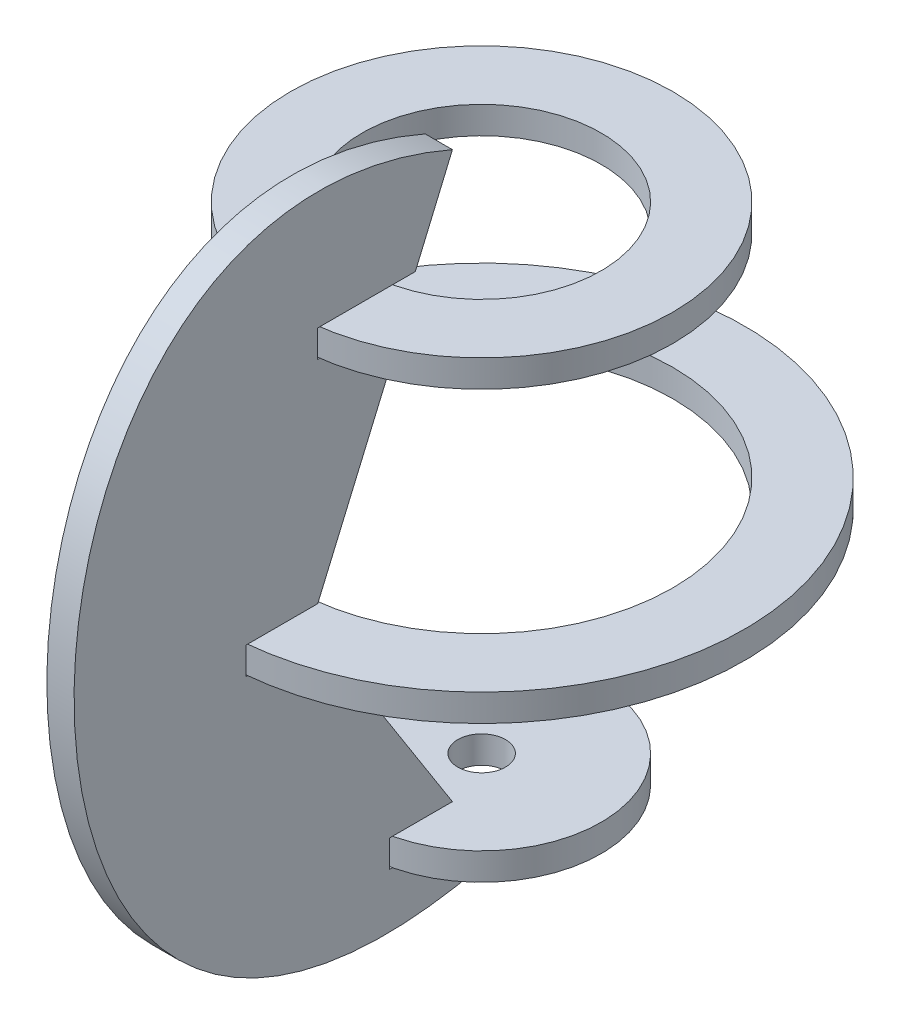
ISO-10303-21;
HEADER;
FILE_DESCRIPTION(('STEP AP214'),'2;1');
FILE_NAME('part.step','',(''),(''),'','','');
FILE_SCHEMA(('AUTOMOTIVE_DESIGN { 1 0 10303 214 1 1 1 1 }'));
ENDSEC;
DATA;
#1=APPLICATION_CONTEXT('core data for automotive mechanical design processes');
#2=APPLICATION_PROTOCOL_DEFINITION('international standard','automotive_design',2000,#1);
#3=PRODUCT_CONTEXT('',#1,'mechanical');
#4=PRODUCT('Part','Part','',(#3));
#5=PRODUCT_RELATED_PRODUCT_CATEGORY('part','',(#4));
#6=PRODUCT_DEFINITION_FORMATION('','',#4);
#7=PRODUCT_DEFINITION_CONTEXT('part definition',#1,'design');
#8=PRODUCT_DEFINITION('design','',#6,#7);
#9=PRODUCT_DEFINITION_SHAPE('','',#8);
#10=(LENGTH_UNIT() NAMED_UNIT(*) SI_UNIT(.MILLI.,.METRE.));
#11=(NAMED_UNIT(*) PLANE_ANGLE_UNIT() SI_UNIT($,.RADIAN.));
#12=(NAMED_UNIT(*) SI_UNIT($,.STERADIAN.) SOLID_ANGLE_UNIT());
#13=UNCERTAINTY_MEASURE_WITH_UNIT(LENGTH_MEASURE(1.E-05),#10,'distance_accuracy_value','');
#14=(GEOMETRIC_REPRESENTATION_CONTEXT(3) GLOBAL_UNCERTAINTY_ASSIGNED_CONTEXT((#13)) GLOBAL_UNIT_ASSIGNED_CONTEXT((#10,
#11,#12)) REPRESENTATION_CONTEXT('',''));
#15=CARTESIAN_POINT('',(0.,0.,0.));
#16=DIRECTION('',(0.,0.,1.));
#17=DIRECTION('',(1.,0.,0.));
#18=AXIS2_PLACEMENT_3D('',#15,#16,#17);
#19=CARTESIAN_POINT('',(5.7,0.,5.));
#20=DIRECTION('',(0.,0.,-1.));
#21=DIRECTION('',(-1.,0.,0.));
#22=AXIS2_PLACEMENT_3D('',#19,#20,#21);
#23=PLANE('',#22);
#24=DIRECTION('',(0.,-1.,0.));
#25=VECTOR('',#24,1.);
#26=CARTESIAN_POINT('',(0.,0.,5.));
#27=LINE('',#26,#25);
#28=CARTESIAN_POINT('',(0.,0.,5.));
#29=VERTEX_POINT('',#28);
#30=CARTESIAN_POINT('',(0.,-8.77412214334572,5.));
#31=VERTEX_POINT('',#30);
#32=EDGE_CURVE('E303',#29,#31,#27,.T.);
#33=ORIENTED_EDGE('',*,*,#32,.F.);
#34=DIRECTION('',(-1.,0.,0.));
#35=VECTOR('',#34,1.);
#36=CARTESIAN_POINT('',(5.7,0.,5.));
#37=LINE('',#36,#35);
#38=CARTESIAN_POINT('',(5.7,0.,5.));
#39=VERTEX_POINT('',#38);
#40=EDGE_CURVE('E13',#39,#29,#37,.T.);
#41=ORIENTED_EDGE('',*,*,#40,.F.);
#42=DIRECTION('',(0.,-1.,0.));
#43=VECTOR('',#42,1.);
#44=CARTESIAN_POINT('',(5.7,0.,5.));
#45=LINE('',#44,#43);
#46=CARTESIAN_POINT('',(5.7,-8.77412214334572,5.));
#47=VERTEX_POINT('',#46);
#48=EDGE_CURVE('E240',#39,#47,#45,.T.);
#49=ORIENTED_EDGE('',*,*,#48,.T.);
#50=DIRECTION('',(-1.,0.,0.));
#51=VECTOR('',#50,1.);
#52=CARTESIAN_POINT('',(5.7,-8.77412214334572,5.));
#53=LINE('',#52,#51);
#54=EDGE_CURVE('E52',#47,#31,#53,.T.);
#55=ORIENTED_EDGE('',*,*,#54,.T.);
#56=EDGE_LOOP('',(#33,#41,#49,#55));
#57=FACE_BOUND('',#56,.T.);
#58=ADVANCED_FACE('F49',(#57),#23,.T.);
#59=CARTESIAN_POINT('',(5.7,0.,25.0225));
#60=DIRECTION('',(0.,1.,0.));
#61=DIRECTION('',(0.,0.,1.));
#62=AXIS2_PLACEMENT_3D('',#59,#60,#61);
#63=PLANE('',#62);
#64=DIRECTION('',(0.,0.,-1.));
#65=VECTOR('',#64,1.);
#66=CARTESIAN_POINT('',(0.,0.,25.0225));
#67=LINE('',#66,#65);
#68=CARTESIAN_POINT('',(0.,0.,25.0225));
#69=VERTEX_POINT('',#68);
#70=EDGE_CURVE('E308',#69,#29,#67,.T.);
#71=ORIENTED_EDGE('',*,*,#70,.F.);
#72=DIRECTION('',(-1.,0.,0.));
#73=VECTOR('',#72,1.);
#74=CARTESIAN_POINT('',(5.7,0.,25.0225));
#75=LINE('',#74,#73);
#76=CARTESIAN_POINT('',(5.7,0.,25.0225));
#77=VERTEX_POINT('',#76);
#78=EDGE_CURVE('E58',#77,#69,#75,.T.);
#79=ORIENTED_EDGE('',*,*,#78,.F.);
#80=DIRECTION('',(0.,0.,-1.));
#81=VECTOR('',#80,1.);
#82=CARTESIAN_POINT('',(5.7,0.,25.0225));
#83=LINE('',#82,#81);
#84=EDGE_CURVE('E172',#77,#39,#83,.T.);
#85=ORIENTED_EDGE('',*,*,#84,.T.);
#86=ORIENTED_EDGE('',*,*,#40,.T.);
#87=EDGE_LOOP('',(#71,#79,#85,#86));
#88=FACE_BOUND('',#87,.T.);
#89=ADVANCED_FACE('F289',(#88),#63,.T.);
#90=CARTESIAN_POINT('',(5.7,5.7,25.0225));
#91=DIRECTION('',(0.,0.,-1.));
#92=DIRECTION('',(-1.,0.,0.));
#93=AXIS2_PLACEMENT_3D('',#90,#91,#92);
#94=PLANE('',#93);
#95=DIRECTION('',(0.,-1.,0.));
#96=VECTOR('',#95,1.);
#97=CARTESIAN_POINT('',(0.,5.7,25.0225));
#98=LINE('',#97,#96);
#99=CARTESIAN_POINT('',(0.,5.7,25.0225));
#100=VERTEX_POINT('',#99);
#101=EDGE_CURVE('E159',#100,#69,#98,.T.);
#102=ORIENTED_EDGE('',*,*,#101,.F.);
#103=DIRECTION('',(-1.,0.,0.));
#104=VECTOR('',#103,1.);
#105=CARTESIAN_POINT('',(5.7,5.7,25.0225));
#106=LINE('',#105,#104);
#107=CARTESIAN_POINT('',(5.7,5.7,25.0225));
#108=VERTEX_POINT('',#107);
#109=EDGE_CURVE('E154',#108,#100,#106,.T.);
#110=ORIENTED_EDGE('',*,*,#109,.F.);
#111=DIRECTION('',(0.,-1.,0.));
#112=VECTOR('',#111,1.);
#113=CARTESIAN_POINT('',(5.7,5.7,25.0225));
#114=LINE('',#113,#112);
#115=EDGE_CURVE('E157',#108,#77,#114,.T.);
#116=ORIENTED_EDGE('',*,*,#115,.T.);
#117=ORIENTED_EDGE('',*,*,#78,.T.);
#118=EDGE_LOOP('',(#102,#110,#116,#117));
#119=FACE_BOUND('',#118,.T.);
#120=ADVANCED_FACE('F156',(#119),#94,.T.);
#121=CARTESIAN_POINT('',(5.7,5.7,11.8183247946143));
#122=DIRECTION('',(0.,-1.,0.));
#123=DIRECTION('',(0.,0.,-1.));
#124=AXIS2_PLACEMENT_3D('',#121,#122,#123);
#125=PLANE('',#124);
#126=DIRECTION('',(0.,0.,1.));
#127=VECTOR('',#126,1.);
#128=CARTESIAN_POINT('',(0.,5.7,11.8183247946143));
#129=LINE('',#128,#127);
#130=CARTESIAN_POINT('',(0.,5.7,11.8183247946143));
#131=VERTEX_POINT('',#130);
#132=EDGE_CURVE('E311',#131,#100,#129,.T.);
#133=ORIENTED_EDGE('',*,*,#132,.F.);
#134=DIRECTION('',(-1.,0.,0.));
#135=VECTOR('',#134,1.);
#136=CARTESIAN_POINT('',(5.7,5.7,11.8183247946143));
#137=LINE('',#136,#135);
#138=CARTESIAN_POINT('',(5.7,5.7,11.8183247946143));
#139=VERTEX_POINT('',#138);
#140=EDGE_CURVE('E164',#139,#131,#137,.T.);
#141=ORIENTED_EDGE('',*,*,#140,.F.);
#142=DIRECTION('',(0.,0.,1.));
#143=VECTOR('',#142,1.);
#144=CARTESIAN_POINT('',(5.7,5.7,11.8183247946143));
#145=LINE('',#144,#143);
#146=EDGE_CURVE('E170',#139,#108,#145,.T.);
#147=ORIENTED_EDGE('',*,*,#146,.T.);
#148=ORIENTED_EDGE('',*,*,#109,.T.);
#149=EDGE_LOOP('',(#133,#141,#147,#148));
#150=FACE_BOUND('',#149,.T.);
#151=ADVANCED_FACE('F175',(#150),#125,.T.);
#152=CARTESIAN_POINT('',(5.7,50.0085592291944,40.0225));
#153=DIRECTION('',(0.,0.536981450409833,-0.843594050426953));
#154=DIRECTION('',(0.,0.843594050426953,0.536981450409833));
#155=AXIS2_PLACEMENT_3D('',#152,#153,#154);
#156=PLANE('',#155);
#157=DIRECTION('',(0.,-0.843594050426953,-0.536981450409833));
#158=VECTOR('',#157,1.);
#159=CARTESIAN_POINT('',(0.,50.0085592291944,40.0225));
#160=LINE('',#159,#158);
#161=CARTESIAN_POINT('',(0.,50.0085592291944,40.0225));
#162=VERTEX_POINT('',#161);
#163=EDGE_CURVE('E368',#162,#131,#160,.T.);
#164=ORIENTED_EDGE('',*,*,#163,.F.);
#165=DIRECTION('',(-1.,0.,0.));
#166=VECTOR('',#165,1.);
#167=CARTESIAN_POINT('',(5.7,50.0085592291944,40.0225));
#168=LINE('',#167,#166);
#169=CARTESIAN_POINT('',(5.7,50.0085592291944,40.0225));
#170=VERTEX_POINT('',#169);
#171=EDGE_CURVE('E317',#170,#162,#168,.T.);
#172=ORIENTED_EDGE('',*,*,#171,.F.);
#173=DIRECTION('',(0.,-0.843594050426953,-0.536981450409833));
#174=VECTOR('',#173,1.);
#175=CARTESIAN_POINT('',(5.7,50.0085592291944,40.0225));
#176=LINE('',#175,#174);
#177=EDGE_CURVE('E177',#170,#139,#176,.T.);
#178=ORIENTED_EDGE('',*,*,#177,.T.);
#179=ORIENTED_EDGE('',*,*,#140,.T.);
#180=EDGE_LOOP('',(#164,#172,#178,#179));
#181=FACE_BOUND('',#180,.T.);
#182=ADVANCED_FACE('F280',(#181),#156,.T.);
#183=CARTESIAN_POINT('',(5.7,50.,55.0225));
#184=DIRECTION('',(0.,0.999999837199141,0.000570615186728014));
#185=DIRECTION('',(0.,-0.000570615186728014,0.999999837199141));
#186=AXIS2_PLACEMENT_3D('',#183,#184,#185);
#187=PLANE('',#186);
#188=DIRECTION('',(0.,0.000570615186728014,-0.999999837199141));
#189=VECTOR('',#188,1.);
#190=CARTESIAN_POINT('',(0.,50.,55.0225));
#191=LINE('',#190,#189);
#192=CARTESIAN_POINT('',(0.,50.,55.0225));
#193=VERTEX_POINT('',#192);
#194=EDGE_CURVE('E365',#193,#162,#191,.T.);
#195=ORIENTED_EDGE('',*,*,#194,.F.);
#196=DIRECTION('',(-1.,0.,0.));
#197=VECTOR('',#196,1.);
#198=CARTESIAN_POINT('',(5.7,50.,55.0225));
#199=LINE('',#198,#197);
#200=CARTESIAN_POINT('',(5.7,50.,55.0225));
#201=VERTEX_POINT('',#200);
#202=EDGE_CURVE('E319',#201,#193,#199,.T.);
#203=ORIENTED_EDGE('',*,*,#202,.F.);
#204=DIRECTION('',(0.,0.000570615186728014,-0.999999837199141));
#205=VECTOR('',#204,1.);
#206=CARTESIAN_POINT('',(5.7,50.,55.0225));
#207=LINE('',#206,#205);
#208=EDGE_CURVE('E180',#201,#170,#207,.T.);
#209=ORIENTED_EDGE('',*,*,#208,.T.);
#210=ORIENTED_EDGE('',*,*,#171,.T.);
#211=EDGE_LOOP('',(#195,#203,#209,#210));
#212=FACE_BOUND('',#211,.T.);
#213=ADVANCED_FACE('F276',(#212),#187,.T.);
#214=CARTESIAN_POINT('',(5.7,55.7,55.0225));
#215=DIRECTION('',(0.,0.,-1.));
#216=DIRECTION('',(-1.,0.,0.));
#217=AXIS2_PLACEMENT_3D('',#214,#215,#216);
#218=PLANE('',#217);
#219=DIRECTION('',(0.,-1.,0.));
#220=VECTOR('',#219,1.);
#221=CARTESIAN_POINT('',(0.,55.7,55.0225));
#222=LINE('',#221,#220);
#223=CARTESIAN_POINT('',(0.,55.7,55.0225));
#224=VERTEX_POINT('',#223);
#225=EDGE_CURVE('E362',#224,#193,#222,.T.);
#226=ORIENTED_EDGE('',*,*,#225,.F.);
#227=DIRECTION('',(-1.,0.,0.));
#228=VECTOR('',#227,1.);
#229=CARTESIAN_POINT('',(5.7,55.7,55.0225));
#230=LINE('',#229,#228);
#231=CARTESIAN_POINT('',(5.7,55.7,55.0225));
#232=VERTEX_POINT('',#231);
#233=EDGE_CURVE('E321',#232,#224,#230,.T.);
#234=ORIENTED_EDGE('',*,*,#233,.F.);
#235=DIRECTION('',(0.,-1.,0.));
#236=VECTOR('',#235,1.);
#237=CARTESIAN_POINT('',(5.7,55.7,55.0225));
#238=LINE('',#237,#236);
#239=EDGE_CURVE('E198',#232,#201,#238,.T.);
#240=ORIENTED_EDGE('',*,*,#239,.T.);
#241=ORIENTED_EDGE('',*,*,#202,.T.);
#242=EDGE_LOOP('',(#226,#234,#240,#241));
#243=FACE_BOUND('',#242,.T.);
#244=ADVANCED_FACE('F272',(#243),#218,.T.);
#245=CARTESIAN_POINT('',(5.7,55.7,40.0225));
#246=DIRECTION('',(0.,-1.,0.));
#247=DIRECTION('',(0.,0.,-1.));
#248=AXIS2_PLACEMENT_3D('',#245,#246,#247);
#249=PLANE('',#248);
#250=DIRECTION('',(0.,0.,1.));
#251=VECTOR('',#250,1.);
#252=CARTESIAN_POINT('',(0.,55.7,40.0225));
#253=LINE('',#252,#251);
#254=CARTESIAN_POINT('',(0.,55.7,40.0225));
#255=VERTEX_POINT('',#254);
#256=EDGE_CURVE('E359',#255,#224,#253,.T.);
#257=ORIENTED_EDGE('',*,*,#256,.F.);
#258=DIRECTION('',(-1.,0.,0.));
#259=VECTOR('',#258,1.);
#260=CARTESIAN_POINT('',(5.7,55.7,40.0225));
#261=LINE('',#260,#259);
#262=CARTESIAN_POINT('',(5.7,55.7,40.0225));
#263=VERTEX_POINT('',#262);
#264=EDGE_CURVE('E323',#263,#255,#261,.T.);
#265=ORIENTED_EDGE('',*,*,#264,.F.);
#266=DIRECTION('',(0.,0.,1.));
#267=VECTOR('',#266,1.);
#268=CARTESIAN_POINT('',(5.7,55.7,40.0225));
#269=LINE('',#268,#267);
#270=EDGE_CURVE('E203',#263,#232,#269,.T.);
#271=ORIENTED_EDGE('',*,*,#270,.T.);
#272=ORIENTED_EDGE('',*,*,#233,.T.);
#273=EDGE_LOOP('',(#257,#265,#271,#272));
#274=FACE_BOUND('',#273,.T.);
#275=ADVANCED_FACE('F268',(#274),#249,.T.);
#276=CARTESIAN_POINT('',(5.7,100.,20.9989229059397));
#277=DIRECTION('',(0.,-0.394582674275684,-0.91886044270142));
#278=DIRECTION('',(0.,0.91886044270142,-0.394582674275685));
#279=AXIS2_PLACEMENT_3D('',#276,#277,#278);
#280=PLANE('',#279);
#281=DIRECTION('',(0.,-0.91886044270142,0.394582674275684));
#282=VECTOR('',#281,1.);
#283=CARTESIAN_POINT('',(0.,100.,20.9989229059397));
#284=LINE('',#283,#282);
#285=CARTESIAN_POINT('',(0.,100.,20.9989229059397));
#286=VERTEX_POINT('',#285);
#287=EDGE_CURVE('E356',#286,#255,#284,.T.);
#288=ORIENTED_EDGE('',*,*,#287,.F.);
#289=DIRECTION('',(-1.,0.,0.));
#290=VECTOR('',#289,1.);
#291=CARTESIAN_POINT('',(5.7,100.,20.9989229059397));
#292=LINE('',#291,#290);
#293=CARTESIAN_POINT('',(5.7,100.,20.9989229059397));
#294=VERTEX_POINT('',#293);
#295=EDGE_CURVE('E325',#294,#286,#292,.T.);
#296=ORIENTED_EDGE('',*,*,#295,.F.);
#297=DIRECTION('',(0.,-0.91886044270142,0.394582674275684));
#298=VECTOR('',#297,1.);
#299=CARTESIAN_POINT('',(5.7,100.,20.9989229059397));
#300=LINE('',#299,#298);
#301=EDGE_CURVE('E208',#294,#263,#300,.T.);
#302=ORIENTED_EDGE('',*,*,#301,.T.);
#303=ORIENTED_EDGE('',*,*,#264,.T.);
#304=EDGE_LOOP('',(#288,#296,#302,#303));
#305=FACE_BOUND('',#304,.T.);
#306=ADVANCED_FACE('F264',(#305),#280,.T.);
#307=CARTESIAN_POINT('',(5.7,100.,40.0225));
#308=DIRECTION('',(0.,1.,0.));
#309=DIRECTION('',(0.,0.,1.));
#310=AXIS2_PLACEMENT_3D('',#307,#308,#309);
#311=PLANE('',#310);
#312=DIRECTION('',(0.,0.,-1.));
#313=VECTOR('',#312,1.);
#314=CARTESIAN_POINT('',(0.,100.,40.0225));
#315=LINE('',#314,#313);
#316=CARTESIAN_POINT('',(0.,100.,40.0225));
#317=VERTEX_POINT('',#316);
#318=EDGE_CURVE('E353',#317,#286,#315,.T.);
#319=ORIENTED_EDGE('',*,*,#318,.F.);
#320=DIRECTION('',(-1.,0.,0.));
#321=VECTOR('',#320,1.);
#322=CARTESIAN_POINT('',(5.7,100.,40.0225));
#323=LINE('',#322,#321);
#324=CARTESIAN_POINT('',(5.7,100.,40.0225));
#325=VERTEX_POINT('',#324);
#326=EDGE_CURVE('E327',#325,#317,#323,.T.);
#327=ORIENTED_EDGE('',*,*,#326,.F.);
#328=DIRECTION('',(0.,0.,-1.));
#329=VECTOR('',#328,1.);
#330=CARTESIAN_POINT('',(5.7,100.,40.0225));
#331=LINE('',#330,#329);
#332=EDGE_CURVE('E216',#325,#294,#331,.T.);
#333=ORIENTED_EDGE('',*,*,#332,.T.);
#334=ORIENTED_EDGE('',*,*,#295,.T.);
#335=EDGE_LOOP('',(#319,#327,#333,#334));
#336=FACE_BOUND('',#335,.T.);
#337=ADVANCED_FACE('F260',(#336),#311,.T.);
#338=CARTESIAN_POINT('',(5.7,105.7,40.0225));
#339=DIRECTION('',(0.,0.,-1.));
#340=DIRECTION('',(-1.,0.,0.));
#341=AXIS2_PLACEMENT_3D('',#338,#339,#340);
#342=PLANE('',#341);
#343=DIRECTION('',(0.,-1.,0.));
#344=VECTOR('',#343,1.);
#345=CARTESIAN_POINT('',(0.,105.7,40.0225));
#346=LINE('',#345,#344);
#347=CARTESIAN_POINT('',(0.,105.7,40.0225));
#348=VERTEX_POINT('',#347);
#349=EDGE_CURVE('E350',#348,#317,#346,.T.);
#350=ORIENTED_EDGE('',*,*,#349,.F.);
#351=DIRECTION('',(-1.,0.,0.));
#352=VECTOR('',#351,1.);
#353=CARTESIAN_POINT('',(5.7,105.7,40.0225));
#354=LINE('',#353,#352);
#355=CARTESIAN_POINT('',(5.7,105.7,40.0225));
#356=VERTEX_POINT('',#355);
#357=EDGE_CURVE('E329',#356,#348,#354,.T.);
#358=ORIENTED_EDGE('',*,*,#357,.F.);
#359=DIRECTION('',(0.,-1.,0.));
#360=VECTOR('',#359,1.);
#361=CARTESIAN_POINT('',(5.7,105.7,40.0225));
#362=LINE('',#361,#360);
#363=EDGE_CURVE('E220',#356,#325,#362,.T.);
#364=ORIENTED_EDGE('',*,*,#363,.T.);
#365=ORIENTED_EDGE('',*,*,#326,.T.);
#366=EDGE_LOOP('',(#350,#358,#364,#365));
#367=FACE_BOUND('',#366,.T.);
#368=ADVANCED_FACE('F256',(#367),#342,.T.);
#369=CARTESIAN_POINT('',(5.7,105.7,19.5846525167893));
#370=DIRECTION('',(0.,-1.,0.));
#371=DIRECTION('',(0.,0.,-1.));
#372=AXIS2_PLACEMENT_3D('',#369,#370,#371);
#373=PLANE('',#372);
#374=DIRECTION('',(0.,0.,1.));
#375=VECTOR('',#374,1.);
#376=CARTESIAN_POINT('',(0.,105.7,19.5846525167893));
#377=LINE('',#376,#375);
#378=CARTESIAN_POINT('',(0.,105.7,19.5846525167893));
#379=VERTEX_POINT('',#378);
#380=EDGE_CURVE('E347',#379,#348,#377,.T.);
#381=ORIENTED_EDGE('',*,*,#380,.F.);
#382=DIRECTION('',(-1.,0.,0.));
#383=VECTOR('',#382,1.);
#384=CARTESIAN_POINT('',(5.7,105.7,19.5846525167893));
#385=LINE('',#384,#383);
#386=CARTESIAN_POINT('',(5.7,105.7,19.5846525167893));
#387=VERTEX_POINT('',#386);
#388=EDGE_CURVE('E331',#387,#379,#385,.T.);
#389=ORIENTED_EDGE('',*,*,#388,.F.);
#390=DIRECTION('',(0.,0.,1.));
#391=VECTOR('',#390,1.);
#392=CARTESIAN_POINT('',(5.7,105.7,19.5846525167893));
#393=LINE('',#392,#391);
#394=EDGE_CURVE('E225',#387,#356,#393,.T.);
#395=ORIENTED_EDGE('',*,*,#394,.T.);
#396=ORIENTED_EDGE('',*,*,#357,.T.);
#397=EDGE_LOOP('',(#381,#389,#395,#396));
#398=FACE_BOUND('',#397,.T.);
#399=ADVANCED_FACE('F252',(#398),#373,.T.);
#400=CARTESIAN_POINT('',(5.7,123.928781979037,11.8183247946143));
#401=DIRECTION('',(0.,-0.391956765841584,-0.919983637740914));
#402=DIRECTION('',(0.,0.919983637740915,-0.391956765841584));
#403=AXIS2_PLACEMENT_3D('',#400,#401,#402);
#404=PLANE('',#403);
#405=DIRECTION('',(0.,-0.919983637740914,0.391956765841584));
#406=VECTOR('',#405,1.);
#407=CARTESIAN_POINT('',(0.,123.928781979037,11.8183247946143));
#408=LINE('',#407,#406);
#409=CARTESIAN_POINT('',(0.,123.928781979037,11.8183247946143));
#410=VERTEX_POINT('',#409);
#411=EDGE_CURVE('E341',#410,#379,#408,.T.);
#412=ORIENTED_EDGE('',*,*,#411,.F.);
#413=DIRECTION('',(-1.,0.,0.));
#414=VECTOR('',#413,1.);
#415=CARTESIAN_POINT('',(5.7,123.928781979037,11.8183247946143));
#416=LINE('',#415,#414);
#417=CARTESIAN_POINT('',(5.7,123.928781979037,11.8183247946143));
#418=VERTEX_POINT('',#417);
#419=EDGE_CURVE('E332',#418,#410,#416,.T.);
#420=ORIENTED_EDGE('',*,*,#419,.F.);
#421=DIRECTION('',(0.,-0.919983637740914,0.391956765841584));
#422=VECTOR('',#421,1.);
#423=CARTESIAN_POINT('',(5.7,123.928781979037,11.8183247946143));
#424=LINE('',#423,#422);
#425=EDGE_CURVE('E230',#418,#387,#424,.T.);
#426=ORIENTED_EDGE('',*,*,#425,.T.);
#427=ORIENTED_EDGE('',*,*,#388,.T.);
#428=EDGE_LOOP('',(#412,#420,#426,#427));
#429=FACE_BOUND('',#428,.T.);
#430=ADVANCED_FACE('F249',(#429),#404,.T.);
#431=CARTESIAN_POINT('',(5.7,-8.77412214334572,5.));
#432=CARTESIAN_POINT('',(5.7,-36.7845838121814,122.039878303891));
#433=CARTESIAN_POINT('',(5.7,169.022277049092,115.13067117282));
#434=CARTESIAN_POINT('',(5.7,123.928781979037,11.8183247946143));
#435=B_SPLINE_CURVE_WITH_KNOTS('',3,(#431,#432,#433,#434),.UNSPECIFIED.,.F.,.F.,(4,4),(0.,1.),.UNSPECIFIED.);
#436=DIRECTION('',(-1.,0.,0.));
#437=VECTOR('',#436,1.);
#438=SURFACE_OF_LINEAR_EXTRUSION('',#435,#437);
#439=CARTESIAN_POINT('',(0.,-8.77412214334572,5.));
#440=CARTESIAN_POINT('',(0.,-36.7845838121814,122.039878303891));
#441=CARTESIAN_POINT('',(0.,169.022277049092,115.13067117282));
#442=CARTESIAN_POINT('',(0.,123.928781979037,11.8183247946143));
#443=B_SPLINE_CURVE_WITH_KNOTS('',3,(#439,#440,#441,#442),.UNSPECIFIED.,.F.,.F.,(4,4),(0.,1.),.UNSPECIFIED.);
#444=EDGE_CURVE('E306',#31,#410,#443,.T.);
#445=ORIENTED_EDGE('',*,*,#444,.F.);
#446=ORIENTED_EDGE('',*,*,#54,.F.);
#447=EDGE_CURVE('E234',#47,#418,#435,.T.);
#448=ORIENTED_EDGE('',*,*,#447,.T.);
#449=ORIENTED_EDGE('',*,*,#419,.T.);
#450=EDGE_LOOP('',(#445,#446,#448,#449));
#451=FACE_BOUND('',#450,.T.);
#452=ADVANCED_FACE('F246',(#451),#438,.T.);
#453=CARTESIAN_POINT('',(5.7,63.983467443303,91.0412466530934));
#454=DIRECTION('',(1.,0.,0.));
#455=DIRECTION('',(0.,0.,-1.));
#456=AXIS2_PLACEMENT_3D('',#453,#454,#455);
#457=PLANE('',#456);
#458=ORIENTED_EDGE('',*,*,#48,.F.);
#459=ORIENTED_EDGE('',*,*,#84,.F.);
#460=ORIENTED_EDGE('',*,*,#115,.F.);
#461=ORIENTED_EDGE('',*,*,#146,.F.);
#462=ORIENTED_EDGE('',*,*,#177,.F.);
#463=ORIENTED_EDGE('',*,*,#208,.F.);
#464=ORIENTED_EDGE('',*,*,#239,.F.);
#465=ORIENTED_EDGE('',*,*,#270,.F.);
#466=ORIENTED_EDGE('',*,*,#301,.F.);
#467=ORIENTED_EDGE('',*,*,#332,.F.);
#468=ORIENTED_EDGE('',*,*,#363,.F.);
#469=ORIENTED_EDGE('',*,*,#394,.F.);
#470=ORIENTED_EDGE('',*,*,#425,.F.);
#471=ORIENTED_EDGE('',*,*,#447,.F.);
#472=EDGE_LOOP('',(#458,#459,#460,#461,#462,#463,#464,#465,#466,#467,#468,#469,#470,#471));
#473=FACE_BOUND('',#472,.T.);
#474=ADVANCED_FACE('F168',(#473),#457,.T.);
#475=CARTESIAN_POINT('',(0.,63.983467443303,91.0412466530934));
#476=DIRECTION('',(1.,0.,0.));
#477=DIRECTION('',(0.,0.,-1.));
#478=AXIS2_PLACEMENT_3D('',#475,#476,#477);
#479=PLANE('',#478);
#480=ORIENTED_EDGE('',*,*,#32,.T.);
#481=ORIENTED_EDGE('',*,*,#444,.T.);
#482=ORIENTED_EDGE('',*,*,#411,.T.);
#483=ORIENTED_EDGE('',*,*,#380,.T.);
#484=ORIENTED_EDGE('',*,*,#349,.T.);
#485=ORIENTED_EDGE('',*,*,#318,.T.);
#486=ORIENTED_EDGE('',*,*,#287,.T.);
#487=ORIENTED_EDGE('',*,*,#256,.T.);
#488=ORIENTED_EDGE('',*,*,#225,.T.);
#489=ORIENTED_EDGE('',*,*,#194,.T.);
#490=ORIENTED_EDGE('',*,*,#163,.T.);
#491=ORIENTED_EDGE('',*,*,#132,.T.);
#492=ORIENTED_EDGE('',*,*,#101,.T.);
#493=ORIENTED_EDGE('',*,*,#70,.T.);
#494=EDGE_LOOP('',(#480,#481,#482,#483,#484,#485,#486,#487,#488,#489,#490,#491,#492,#493));
#495=FACE_BOUND('',#494,.T.);
#496=ADVANCED_FACE('F292',(#495),#479,.F.);
#497=CLOSED_SHELL('',(#58,#89,#120,#151,#182,#213,#244,#275,#306,#337,#368,#399,#430,#452,#474,#496));
#498=MANIFOLD_SOLID_BREP('B2',#497);
#499=CARTESIAN_POINT('',(0.,105.7,0.));
#500=DIRECTION('',(0.,1.,0.));
#501=DIRECTION('',(0.,0.,1.));
#502=AXIS2_PLACEMENT_3D('',#499,#500,#501);
#503=PLANE('',#502);
#504=CARTESIAN_POINT('',(0.,105.7,0.));
#505=DIRECTION('',(0.,1.,0.));
#506=DIRECTION('',(0.,0.,1.));
#507=AXIS2_PLACEMENT_3D('',#504,#505,#506);
#508=CIRCLE('',#507,40.0225);
#509=CARTESIAN_POINT('',(0.,105.7,40.0225));
#510=VERTEX_POINT('',#509);
#511=EDGE_CURVE('E48',#510,#510,#508,.T.);
#512=ORIENTED_EDGE('',*,*,#511,.T.);
#513=EDGE_LOOP('',(#512));
#514=FACE_BOUND('',#513,.T.);
#515=CARTESIAN_POINT('',(0.,105.7,0.));
#516=DIRECTION('',(0.,1.,0.));
#517=DIRECTION('',(0.,0.,1.));
#518=AXIS2_PLACEMENT_3D('',#515,#516,#517);
#519=CIRCLE('',#518,25.0225);
#520=CARTESIAN_POINT('',(0.,105.7,25.0225));
#521=VERTEX_POINT('',#520);
#522=EDGE_CURVE('E502',#521,#521,#519,.T.);
#523=ORIENTED_EDGE('',*,*,#522,.F.);
#524=EDGE_LOOP('',(#523));
#525=FACE_BOUND('',#524,.T.);
#526=ADVANCED_FACE('F491',(#514,#525),#503,.T.);
#527=CARTESIAN_POINT('',(0.,100.,0.));
#528=DIRECTION('',(0.,1.,0.));
#529=DIRECTION('',(0.,0.,1.));
#530=AXIS2_PLACEMENT_3D('',#527,#528,#529);
#531=PLANE('',#530);
#532=CARTESIAN_POINT('',(0.,100.,0.));
#533=DIRECTION('',(0.,1.,0.));
#534=DIRECTION('',(0.,0.,1.));
#535=AXIS2_PLACEMENT_3D('',#532,#533,#534);
#536=CIRCLE('',#535,40.0225);
#537=CARTESIAN_POINT('',(0.,100.,40.0225));
#538=VERTEX_POINT('',#537);
#539=EDGE_CURVE('E495',#538,#538,#536,.T.);
#540=ORIENTED_EDGE('',*,*,#539,.F.);
#541=EDGE_LOOP('',(#540));
#542=FACE_BOUND('',#541,.T.);
#543=CARTESIAN_POINT('',(0.,100.,0.));
#544=DIRECTION('',(0.,1.,0.));
#545=DIRECTION('',(0.,0.,1.));
#546=AXIS2_PLACEMENT_3D('',#543,#544,#545);
#547=CIRCLE('',#546,25.0225);
#548=CARTESIAN_POINT('',(0.,100.,25.0225));
#549=VERTEX_POINT('',#548);
#550=EDGE_CURVE('E504',#549,#549,#547,.T.);
#551=ORIENTED_EDGE('',*,*,#550,.T.);
#552=EDGE_LOOP('',(#551));
#553=FACE_BOUND('',#552,.T.);
#554=ADVANCED_FACE('F514',(#542,#553),#531,.F.);
#555=CARTESIAN_POINT('',(0.,105.7,0.));
#556=DIRECTION('',(0.,-1.,0.));
#557=DIRECTION('',(0.,0.,-1.));
#558=AXIS2_PLACEMENT_3D('',#555,#556,#557);
#559=CYLINDRICAL_SURFACE('',#558,40.0225);
#560=ORIENTED_EDGE('',*,*,#511,.F.);
#561=EDGE_LOOP('',(#560));
#562=FACE_BOUND('',#561,.T.);
#563=ORIENTED_EDGE('',*,*,#539,.T.);
#564=EDGE_LOOP('',(#563));
#565=FACE_BOUND('',#564,.T.);
#566=ADVANCED_FACE('F493',(#562,#565),#559,.T.);
#567=CARTESIAN_POINT('',(0.,105.7,0.));
#568=DIRECTION('',(0.,-1.,0.));
#569=DIRECTION('',(0.,0.,-1.));
#570=AXIS2_PLACEMENT_3D('',#567,#568,#569);
#571=CYLINDRICAL_SURFACE('',#570,25.0225);
#572=ORIENTED_EDGE('',*,*,#522,.T.);
#573=EDGE_LOOP('',(#572));
#574=FACE_BOUND('',#573,.T.);
#575=ORIENTED_EDGE('',*,*,#550,.F.);
#576=EDGE_LOOP('',(#575));
#577=FACE_BOUND('',#576,.T.);
#578=ADVANCED_FACE('F510',(#574,#577),#571,.F.);
#579=CLOSED_SHELL('',(#526,#554,#566,#578));
#580=MANIFOLD_SOLID_BREP('B7_NOT_SHOWN',#579);
#581=CARTESIAN_POINT('',(0.,55.7,0.));
#582=DIRECTION('',(0.,1.,0.));
#583=DIRECTION('',(0.,0.,1.));
#584=AXIS2_PLACEMENT_3D('',#581,#582,#583);
#585=PLANE('',#584);
#586=CARTESIAN_POINT('',(0.,55.7,0.));
#587=DIRECTION('',(0.,1.,0.));
#588=DIRECTION('',(0.,0.,1.));
#589=AXIS2_PLACEMENT_3D('',#586,#587,#588);
#590=CIRCLE('',#589,55.0225);
#591=CARTESIAN_POINT('',(0.,55.7,55.0225));
#592=VERTEX_POINT('',#591);
#593=EDGE_CURVE('E490',#592,#592,#590,.T.);
#594=ORIENTED_EDGE('',*,*,#593,.T.);
#595=EDGE_LOOP('',(#594));
#596=FACE_BOUND('',#595,.T.);
#597=CARTESIAN_POINT('',(0.,55.7,0.));
#598=DIRECTION('',(0.,1.,0.));
#599=DIRECTION('',(0.,0.,1.));
#600=AXIS2_PLACEMENT_3D('',#597,#598,#599);
#601=CIRCLE('',#600,40.0225);
#602=CARTESIAN_POINT('',(0.,55.7,40.0225));
#603=VERTEX_POINT('',#602);
#604=EDGE_CURVE('E571',#603,#603,#601,.T.);
#605=ORIENTED_EDGE('',*,*,#604,.F.);
#606=EDGE_LOOP('',(#605));
#607=FACE_BOUND('',#606,.T.);
#608=ADVANCED_FACE('F560',(#596,#607),#585,.T.);
#609=CARTESIAN_POINT('',(0.,50.,0.));
#610=DIRECTION('',(0.,1.,0.));
#611=DIRECTION('',(0.,0.,1.));
#612=AXIS2_PLACEMENT_3D('',#609,#610,#611);
#613=PLANE('',#612);
#614=CARTESIAN_POINT('',(0.,50.,0.));
#615=DIRECTION('',(0.,1.,0.));
#616=DIRECTION('',(0.,0.,1.));
#617=AXIS2_PLACEMENT_3D('',#614,#615,#616);
#618=CIRCLE('',#617,55.0225);
#619=CARTESIAN_POINT('',(0.,50.,55.0225));
#620=VERTEX_POINT('',#619);
#621=EDGE_CURVE('E564',#620,#620,#618,.T.);
#622=ORIENTED_EDGE('',*,*,#621,.F.);
#623=EDGE_LOOP('',(#622));
#624=FACE_BOUND('',#623,.T.);
#625=CARTESIAN_POINT('',(0.,50.,0.));
#626=DIRECTION('',(0.,1.,0.));
#627=DIRECTION('',(0.,0.,1.));
#628=AXIS2_PLACEMENT_3D('',#625,#626,#627);
#629=CIRCLE('',#628,40.0225);
#630=CARTESIAN_POINT('',(0.,50.,40.0225));
#631=VERTEX_POINT('',#630);
#632=EDGE_CURVE('E573',#631,#631,#629,.T.);
#633=ORIENTED_EDGE('',*,*,#632,.T.);
#634=EDGE_LOOP('',(#633));
#635=FACE_BOUND('',#634,.T.);
#636=ADVANCED_FACE('F583',(#624,#635),#613,.F.);
#637=CARTESIAN_POINT('',(0.,55.7,0.));
#638=DIRECTION('',(0.,-1.,0.));
#639=DIRECTION('',(0.,0.,-1.));
#640=AXIS2_PLACEMENT_3D('',#637,#638,#639);
#641=CYLINDRICAL_SURFACE('',#640,55.0225);
#642=ORIENTED_EDGE('',*,*,#593,.F.);
#643=EDGE_LOOP('',(#642));
#644=FACE_BOUND('',#643,.T.);
#645=ORIENTED_EDGE('',*,*,#621,.T.);
#646=EDGE_LOOP('',(#645));
#647=FACE_BOUND('',#646,.T.);
#648=ADVANCED_FACE('F562',(#644,#647),#641,.T.);
#649=CARTESIAN_POINT('',(0.,55.7,0.));
#650=DIRECTION('',(0.,-1.,0.));
#651=DIRECTION('',(0.,0.,-1.));
#652=AXIS2_PLACEMENT_3D('',#649,#650,#651);
#653=CYLINDRICAL_SURFACE('',#652,40.0225);
#654=ORIENTED_EDGE('',*,*,#604,.T.);
#655=EDGE_LOOP('',(#654));
#656=FACE_BOUND('',#655,.T.);
#657=ORIENTED_EDGE('',*,*,#632,.F.);
#658=EDGE_LOOP('',(#657));
#659=FACE_BOUND('',#658,.T.);
#660=ADVANCED_FACE('F579',(#656,#659),#653,.F.);
#661=CLOSED_SHELL('',(#608,#636,#648,#660));
#662=MANIFOLD_SOLID_BREP('B43_NOT_SHOWN',#661);
#663=CARTESIAN_POINT('',(0.,5.7,0.));
#664=DIRECTION('',(0.,1.,0.));
#665=DIRECTION('',(0.,0.,1.));
#666=AXIS2_PLACEMENT_3D('',#663,#664,#665);
#667=PLANE('',#666);
#668=CARTESIAN_POINT('',(0.,5.7,0.));
#669=DIRECTION('',(0.,1.,0.));
#670=DIRECTION('',(0.,0.,1.));
#671=AXIS2_PLACEMENT_3D('',#668,#669,#670);
#672=CIRCLE('',#671,25.0225);
#673=CARTESIAN_POINT('',(0.,5.7,25.0225));
#674=VERTEX_POINT('',#673);
#675=EDGE_CURVE('E559',#674,#674,#672,.T.);
#676=ORIENTED_EDGE('',*,*,#675,.T.);
#677=EDGE_LOOP('',(#676));
#678=FACE_BOUND('',#677,.T.);
#679=CARTESIAN_POINT('',(0.,5.7,0.));
#680=DIRECTION('',(0.,1.,0.));
#681=DIRECTION('',(0.,0.,1.));
#682=AXIS2_PLACEMENT_3D('',#679,#680,#681);
#683=CIRCLE('',#682,5.);
#684=CARTESIAN_POINT('',(0.,5.7,5.));
#685=VERTEX_POINT('',#684);
#686=EDGE_CURVE('E633',#685,#685,#683,.T.);
#687=ORIENTED_EDGE('',*,*,#686,.F.);
#688=EDGE_LOOP('',(#687));
#689=FACE_BOUND('',#688,.T.);
#690=ADVANCED_FACE('F622',(#678,#689),#667,.T.);
#691=CARTESIAN_POINT('',(0.,0.,0.));
#692=DIRECTION('',(0.,1.,0.));
#693=DIRECTION('',(0.,0.,1.));
#694=AXIS2_PLACEMENT_3D('',#691,#692,#693);
#695=PLANE('',#694);
#696=CARTESIAN_POINT('',(0.,0.,0.));
#697=DIRECTION('',(0.,1.,0.));
#698=DIRECTION('',(0.,0.,1.));
#699=AXIS2_PLACEMENT_3D('',#696,#697,#698);
#700=CIRCLE('',#699,25.0225);
#701=CARTESIAN_POINT('',(0.,0.,25.0225));
#702=VERTEX_POINT('',#701);
#703=EDGE_CURVE('E626',#702,#702,#700,.T.);
#704=ORIENTED_EDGE('',*,*,#703,.F.);
#705=EDGE_LOOP('',(#704));
#706=FACE_BOUND('',#705,.T.);
#707=CARTESIAN_POINT('',(0.,0.,0.));
#708=DIRECTION('',(0.,1.,0.));
#709=DIRECTION('',(0.,0.,1.));
#710=AXIS2_PLACEMENT_3D('',#707,#708,#709);
#711=CIRCLE('',#710,5.);
#712=CARTESIAN_POINT('',(0.,0.,5.));
#713=VERTEX_POINT('',#712);
#714=EDGE_CURVE('E635',#713,#713,#711,.T.);
#715=ORIENTED_EDGE('',*,*,#714,.T.);
#716=EDGE_LOOP('',(#715));
#717=FACE_BOUND('',#716,.T.);
#718=ADVANCED_FACE('F645',(#706,#717),#695,.F.);
#719=CARTESIAN_POINT('',(0.,5.7,0.));
#720=DIRECTION('',(0.,-1.,0.));
#721=DIRECTION('',(0.,0.,-1.));
#722=AXIS2_PLACEMENT_3D('',#719,#720,#721);
#723=CYLINDRICAL_SURFACE('',#722,25.0225);
#724=ORIENTED_EDGE('',*,*,#675,.F.);
#725=EDGE_LOOP('',(#724));
#726=FACE_BOUND('',#725,.T.);
#727=ORIENTED_EDGE('',*,*,#703,.T.);
#728=EDGE_LOOP('',(#727));
#729=FACE_BOUND('',#728,.T.);
#730=ADVANCED_FACE('F624',(#726,#729),#723,.T.);
#731=CARTESIAN_POINT('',(0.,5.7,0.));
#732=DIRECTION('',(0.,-1.,0.));
#733=DIRECTION('',(0.,0.,-1.));
#734=AXIS2_PLACEMENT_3D('',#731,#732,#733);
#735=CYLINDRICAL_SURFACE('',#734,5.);
#736=ORIENTED_EDGE('',*,*,#686,.T.);
#737=EDGE_LOOP('',(#736));
#738=FACE_BOUND('',#737,.T.);
#739=ORIENTED_EDGE('',*,*,#714,.F.);
#740=EDGE_LOOP('',(#739));
#741=FACE_BOUND('',#740,.T.);
#742=ADVANCED_FACE('F641',(#738,#741),#735,.F.);
#743=CLOSED_SHELL('',(#690,#718,#730,#742));
#744=MANIFOLD_SOLID_BREP('B485_NOT_SHOWN',#743);
#745=ADVANCED_BREP_SHAPE_REPRESENTATION('',(#18,#498,#580,#662,#744),#14);
#746=SHAPE_DEFINITION_REPRESENTATION(#9,#745);
ENDSEC;
END-ISO-10303-21;
